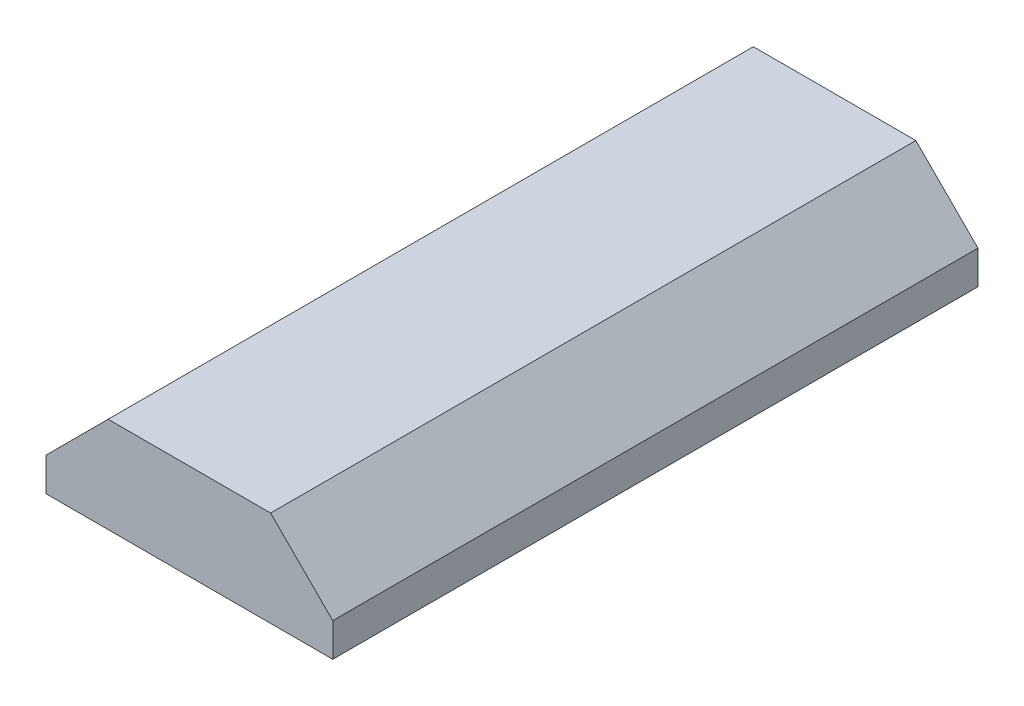
ISO-10303-21;
HEADER;
FILE_DESCRIPTION(('STEP AP214'),'2;1');
FILE_NAME('part.step','',(''),(''),'','','');
FILE_SCHEMA(('AUTOMOTIVE_DESIGN { 1 0 10303 214 1 1 1 1 }'));
ENDSEC;
DATA;
#1=APPLICATION_CONTEXT('core data for automotive mechanical design processes');
#2=APPLICATION_PROTOCOL_DEFINITION('international standard','automotive_design',2000,#1);
#3=PRODUCT_CONTEXT('',#1,'mechanical');
#4=PRODUCT('Part','Part','',(#3));
#5=PRODUCT_RELATED_PRODUCT_CATEGORY('part','',(#4));
#6=PRODUCT_DEFINITION_FORMATION('','',#4);
#7=PRODUCT_DEFINITION_CONTEXT('part definition',#1,'design');
#8=PRODUCT_DEFINITION('design','',#6,#7);
#9=PRODUCT_DEFINITION_SHAPE('','',#8);
#10=(LENGTH_UNIT() NAMED_UNIT(*) SI_UNIT(.MILLI.,.METRE.));
#11=(NAMED_UNIT(*) PLANE_ANGLE_UNIT() SI_UNIT($,.RADIAN.));
#12=(NAMED_UNIT(*) SI_UNIT($,.STERADIAN.) SOLID_ANGLE_UNIT());
#13=UNCERTAINTY_MEASURE_WITH_UNIT(LENGTH_MEASURE(1.E-05),#10,'distance_accuracy_value','');
#14=(GEOMETRIC_REPRESENTATION_CONTEXT(3) GLOBAL_UNCERTAINTY_ASSIGNED_CONTEXT((#13)) GLOBAL_UNIT_ASSIGNED_CONTEXT((#10,
#11,#12)) REPRESENTATION_CONTEXT('',''));
#15=CARTESIAN_POINT('',(0.,0.,0.));
#16=DIRECTION('',(0.,0.,1.));
#17=DIRECTION('',(1.,0.,0.));
#18=AXIS2_PLACEMENT_3D('',#15,#16,#17);
#19=CARTESIAN_POINT('',(3.4,1.80885878693797,27.));
#20=DIRECTION('',(0.707106781186549,0.707106781186546,0.));
#21=DIRECTION('',(-0.707106781186546,0.707106781186549,0.));
#22=AXIS2_PLACEMENT_3D('',#19,#20,#21);
#23=PLANE('',#22);
#24=DIRECTION('',(0.707106781186546,-0.707106781186549,0.));
#25=VECTOR('',#24,1.);
#26=CARTESIAN_POINT('',(3.4,1.80885878693797,0.));
#27=LINE('',#26,#25);
#28=CARTESIAN_POINT('',(3.4,1.80885878693797,0.));
#29=VERTEX_POINT('',#28);
#30=CARTESIAN_POINT('',(6.,-0.791141213062042,0.));
#31=VERTEX_POINT('',#30);
#32=EDGE_CURVE('E127',#29,#31,#27,.T.);
#33=ORIENTED_EDGE('',*,*,#32,.F.);
#34=DIRECTION('',(0.,0.,-1.));
#35=VECTOR('',#34,1.);
#36=CARTESIAN_POINT('',(3.4,1.80885878693797,27.));
#37=LINE('',#36,#35);
#38=CARTESIAN_POINT('',(3.4,1.80885878693797,27.));
#39=VERTEX_POINT('',#38);
#40=EDGE_CURVE('E11',#39,#29,#37,.T.);
#41=ORIENTED_EDGE('',*,*,#40,.F.);
#42=DIRECTION('',(0.707106781186546,-0.707106781186549,0.));
#43=VECTOR('',#42,1.);
#44=CARTESIAN_POINT('',(3.4,1.80885878693797,27.));
#45=LINE('',#44,#43);
#46=CARTESIAN_POINT('',(6.,-0.791141213062042,27.));
#47=VERTEX_POINT('',#46);
#48=EDGE_CURVE('E139',#39,#47,#45,.T.);
#49=ORIENTED_EDGE('',*,*,#48,.T.);
#50=DIRECTION('',(0.,0.,-1.));
#51=VECTOR('',#50,1.);
#52=CARTESIAN_POINT('',(6.,-0.791141213062042,27.));
#53=LINE('',#52,#51);
#54=EDGE_CURVE('E44',#47,#31,#53,.T.);
#55=ORIENTED_EDGE('',*,*,#54,.T.);
#56=EDGE_LOOP('',(#33,#41,#49,#55));
#57=FACE_BOUND('',#56,.T.);
#58=ADVANCED_FACE('F41',(#57),#23,.T.);
#59=CARTESIAN_POINT('',(3.4,1.80885878693797,27.));
#60=DIRECTION('',(0.,-1.,0.));
#61=DIRECTION('',(0.,0.,-1.));
#62=AXIS2_PLACEMENT_3D('',#59,#60,#61);
#63=PLANE('',#62);
#64=DIRECTION('',(-1.,0.,0.));
#65=VECTOR('',#64,1.);
#66=CARTESIAN_POINT('',(3.4,1.80885878693797,0.));
#67=LINE('',#66,#65);
#68=CARTESIAN_POINT('',(-3.4,1.80885878693797,0.));
#69=VERTEX_POINT('',#68);
#70=EDGE_CURVE('E80',#29,#69,#67,.T.);
#71=ORIENTED_EDGE('',*,*,#70,.T.);
#72=DIRECTION('',(0.,0.,-1.));
#73=VECTOR('',#72,1.);
#74=CARTESIAN_POINT('',(-3.4,1.80885878693797,27.));
#75=LINE('',#74,#73);
#76=CARTESIAN_POINT('',(-3.4,1.80885878693797,27.));
#77=VERTEX_POINT('',#76);
#78=EDGE_CURVE('E50',#77,#69,#75,.T.);
#79=ORIENTED_EDGE('',*,*,#78,.F.);
#80=DIRECTION('',(-1.,0.,0.));
#81=VECTOR('',#80,1.);
#82=CARTESIAN_POINT('',(3.4,1.80885878693797,27.));
#83=LINE('',#82,#81);
#84=EDGE_CURVE('E105',#39,#77,#83,.T.);
#85=ORIENTED_EDGE('',*,*,#84,.F.);
#86=ORIENTED_EDGE('',*,*,#40,.T.);
#87=EDGE_LOOP('',(#71,#79,#85,#86));
#88=FACE_BOUND('',#87,.T.);
#89=ADVANCED_FACE('F159',(#88),#63,.F.);
#90=CARTESIAN_POINT('',(-3.4,1.80885878693797,27.));
#91=DIRECTION('',(0.707106781186549,-0.707106781186546,0.));
#92=DIRECTION('',(0.707106781186546,0.707106781186549,0.));
#93=AXIS2_PLACEMENT_3D('',#90,#91,#92);
#94=PLANE('',#93);
#95=DIRECTION('',(-0.707106781186546,-0.707106781186549,0.));
#96=VECTOR('',#95,1.);
#97=CARTESIAN_POINT('',(-3.4,1.80885878693797,0.));
#98=LINE('',#97,#96);
#99=CARTESIAN_POINT('',(-6.,-0.791141213062042,0.));
#100=VERTEX_POINT('',#99);
#101=EDGE_CURVE('E112',#69,#100,#98,.T.);
#102=ORIENTED_EDGE('',*,*,#101,.T.);
#103=DIRECTION('',(0.,0.,-1.));
#104=VECTOR('',#103,1.);
#105=CARTESIAN_POINT('',(-6.,-0.791141213062042,27.));
#106=LINE('',#105,#104);
#107=CARTESIAN_POINT('',(-6.,-0.791141213062042,27.));
#108=VERTEX_POINT('',#107);
#109=EDGE_CURVE('E109',#108,#100,#106,.T.);
#110=ORIENTED_EDGE('',*,*,#109,.F.);
#111=DIRECTION('',(-0.707106781186546,-0.707106781186549,0.));
#112=VECTOR('',#111,1.);
#113=CARTESIAN_POINT('',(-3.4,1.80885878693797,27.));
#114=LINE('',#113,#112);
#115=EDGE_CURVE('E98',#77,#108,#114,.T.);
#116=ORIENTED_EDGE('',*,*,#115,.F.);
#117=ORIENTED_EDGE('',*,*,#78,.T.);
#118=EDGE_LOOP('',(#102,#110,#116,#117));
#119=FACE_BOUND('',#118,.T.);
#120=ADVANCED_FACE('F110',(#119),#94,.F.);
#121=CARTESIAN_POINT('',(-6.,-0.791141213062042,27.));
#122=DIRECTION('',(1.,0.,0.));
#123=DIRECTION('',(0.,0.,-1.));
#124=AXIS2_PLACEMENT_3D('',#121,#122,#123);
#125=PLANE('',#124);
#126=DIRECTION('',(0.,-1.,0.));
#127=VECTOR('',#126,1.);
#128=CARTESIAN_POINT('',(-6.,-0.791141213062042,0.));
#129=LINE('',#128,#127);
#130=CARTESIAN_POINT('',(-6.,-2.19114121306203,0.));
#131=VERTEX_POINT('',#130);
#132=EDGE_CURVE('E136',#100,#131,#129,.T.);
#133=ORIENTED_EDGE('',*,*,#132,.T.);
#134=DIRECTION('',(0.,0.,-1.));
#135=VECTOR('',#134,1.);
#136=CARTESIAN_POINT('',(-6.,-2.19114121306203,27.));
#137=LINE('',#136,#135);
#138=CARTESIAN_POINT('',(-6.,-2.19114121306203,27.));
#139=VERTEX_POINT('',#138);
#140=EDGE_CURVE('E115',#139,#131,#137,.T.);
#141=ORIENTED_EDGE('',*,*,#140,.F.);
#142=DIRECTION('',(0.,-1.,0.));
#143=VECTOR('',#142,1.);
#144=CARTESIAN_POINT('',(-6.,-0.791141213062042,27.));
#145=LINE('',#144,#143);
#146=EDGE_CURVE('E103',#108,#139,#145,.T.);
#147=ORIENTED_EDGE('',*,*,#146,.F.);
#148=ORIENTED_EDGE('',*,*,#109,.T.);
#149=EDGE_LOOP('',(#133,#141,#147,#148));
#150=FACE_BOUND('',#149,.T.);
#151=ADVANCED_FACE('F117',(#150),#125,.F.);
#152=CARTESIAN_POINT('',(-6.,-2.19114121306203,27.));
#153=DIRECTION('',(0.,1.,0.));
#154=DIRECTION('',(0.,0.,1.));
#155=AXIS2_PLACEMENT_3D('',#152,#153,#154);
#156=PLANE('',#155);
#157=DIRECTION('',(1.,0.,0.));
#158=VECTOR('',#157,1.);
#159=CARTESIAN_POINT('',(-6.,-2.19114121306203,0.));
#160=LINE('',#159,#158);
#161=CARTESIAN_POINT('',(6.,-2.19114121306203,0.));
#162=VERTEX_POINT('',#161);
#163=EDGE_CURVE('E133',#131,#162,#160,.T.);
#164=ORIENTED_EDGE('',*,*,#163,.T.);
#165=DIRECTION('',(0.,0.,-1.));
#166=VECTOR('',#165,1.);
#167=CARTESIAN_POINT('',(6.,-2.19114121306203,27.));
#168=LINE('',#167,#166);
#169=CARTESIAN_POINT('',(6.,-2.19114121306203,27.));
#170=VERTEX_POINT('',#169);
#171=EDGE_CURVE('E142',#170,#162,#168,.T.);
#172=ORIENTED_EDGE('',*,*,#171,.F.);
#173=DIRECTION('',(1.,0.,0.));
#174=VECTOR('',#173,1.);
#175=CARTESIAN_POINT('',(-6.,-2.19114121306203,27.));
#176=LINE('',#175,#174);
#177=EDGE_CURVE('E120',#139,#170,#176,.T.);
#178=ORIENTED_EDGE('',*,*,#177,.F.);
#179=ORIENTED_EDGE('',*,*,#140,.T.);
#180=EDGE_LOOP('',(#164,#172,#178,#179));
#181=FACE_BOUND('',#180,.T.);
#182=ADVANCED_FACE('F149',(#181),#156,.F.);
#183=CARTESIAN_POINT('',(6.,-0.791141213062042,27.));
#184=DIRECTION('',(1.,0.,0.));
#185=DIRECTION('',(0.,0.,-1.));
#186=AXIS2_PLACEMENT_3D('',#183,#184,#185);
#187=PLANE('',#186);
#188=DIRECTION('',(0.,-1.,0.));
#189=VECTOR('',#188,1.);
#190=CARTESIAN_POINT('',(6.,-0.791141213062042,0.));
#191=LINE('',#190,#189);
#192=EDGE_CURVE('E130',#31,#162,#191,.T.);
#193=ORIENTED_EDGE('',*,*,#192,.F.);
#194=ORIENTED_EDGE('',*,*,#54,.F.);
#195=DIRECTION('',(0.,-1.,0.));
#196=VECTOR('',#195,1.);
#197=CARTESIAN_POINT('',(6.,-0.791141213062042,27.));
#198=LINE('',#197,#196);
#199=EDGE_CURVE('E122',#47,#170,#198,.T.);
#200=ORIENTED_EDGE('',*,*,#199,.T.);
#201=ORIENTED_EDGE('',*,*,#171,.T.);
#202=EDGE_LOOP('',(#193,#194,#200,#201));
#203=FACE_BOUND('',#202,.T.);
#204=ADVANCED_FACE('F144',(#203),#187,.T.);
#205=CARTESIAN_POINT('',(0.,0.,27.));
#206=DIRECTION('',(0.,0.,-1.));
#207=DIRECTION('',(-1.,0.,0.));
#208=AXIS2_PLACEMENT_3D('',#205,#206,#207);
#209=PLANE('',#208);
#210=ORIENTED_EDGE('',*,*,#48,.F.);
#211=ORIENTED_EDGE('',*,*,#84,.T.);
#212=ORIENTED_EDGE('',*,*,#115,.T.);
#213=ORIENTED_EDGE('',*,*,#146,.T.);
#214=ORIENTED_EDGE('',*,*,#177,.T.);
#215=ORIENTED_EDGE('',*,*,#199,.F.);
#216=EDGE_LOOP('',(#210,#211,#212,#213,#214,#215));
#217=FACE_BOUND('',#216,.T.);
#218=ADVANCED_FACE('F101',(#217),#209,.F.);
#219=CARTESIAN_POINT('',(0.,0.,0.));
#220=DIRECTION('',(0.,0.,-1.));
#221=DIRECTION('',(-1.,0.,0.));
#222=AXIS2_PLACEMENT_3D('',#219,#220,#221);
#223=PLANE('',#222);
#224=ORIENTED_EDGE('',*,*,#32,.T.);
#225=ORIENTED_EDGE('',*,*,#192,.T.);
#226=ORIENTED_EDGE('',*,*,#163,.F.);
#227=ORIENTED_EDGE('',*,*,#132,.F.);
#228=ORIENTED_EDGE('',*,*,#101,.F.);
#229=ORIENTED_EDGE('',*,*,#70,.F.);
#230=EDGE_LOOP('',(#224,#225,#226,#227,#228,#229));
#231=FACE_BOUND('',#230,.T.);
#232=ADVANCED_FACE('F147',(#231),#223,.T.);
#233=CLOSED_SHELL('',(#58,#89,#120,#151,#182,#204,#218,#232));
#234=MANIFOLD_SOLID_BREP('B2',#233);
#235=ADVANCED_BREP_SHAPE_REPRESENTATION('',(#18,#234),#14);
#236=SHAPE_DEFINITION_REPRESENTATION(#9,#235);
ENDSEC;
END-ISO-10303-21;
